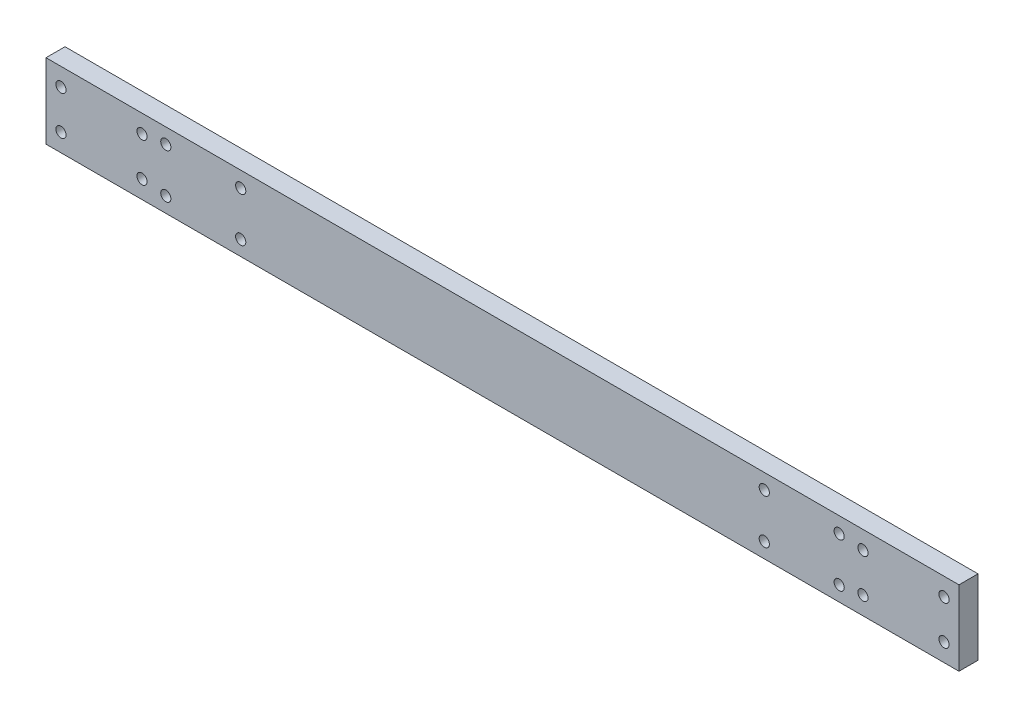
ISO-10303-21;
HEADER;
FILE_DESCRIPTION(('STEP AP214'),'2;1');
FILE_NAME('part.step','',(''),(''),'','','');
FILE_SCHEMA(('AUTOMOTIVE_DESIGN { 1 0 10303 214 1 1 1 1 }'));
ENDSEC;
DATA;
#1=APPLICATION_CONTEXT('core data for automotive mechanical design processes');
#2=APPLICATION_PROTOCOL_DEFINITION('international standard','automotive_design',2000,#1);
#3=PRODUCT_CONTEXT('',#1,'mechanical');
#4=PRODUCT('Part','Part','',(#3));
#5=PRODUCT_RELATED_PRODUCT_CATEGORY('part','',(#4));
#6=PRODUCT_DEFINITION_FORMATION('','',#4);
#7=PRODUCT_DEFINITION_CONTEXT('part definition',#1,'design');
#8=PRODUCT_DEFINITION('design','',#6,#7);
#9=PRODUCT_DEFINITION_SHAPE('','',#8);
#10=(LENGTH_UNIT() NAMED_UNIT(*) SI_UNIT(.MILLI.,.METRE.));
#11=(NAMED_UNIT(*) PLANE_ANGLE_UNIT() SI_UNIT($,.RADIAN.));
#12=(NAMED_UNIT(*) SI_UNIT($,.STERADIAN.) SOLID_ANGLE_UNIT());
#13=UNCERTAINTY_MEASURE_WITH_UNIT(LENGTH_MEASURE(1.E-05),#10,'distance_accuracy_value','');
#14=(GEOMETRIC_REPRESENTATION_CONTEXT(3) GLOBAL_UNCERTAINTY_ASSIGNED_CONTEXT((#13)) GLOBAL_UNIT_ASSIGNED_CONTEXT((#10,
#11,#12)) REPRESENTATION_CONTEXT('',''));
#15=CARTESIAN_POINT('',(0.,0.,0.));
#16=DIRECTION('',(0.,0.,1.));
#17=DIRECTION('',(1.,0.,0.));
#18=AXIS2_PLACEMENT_3D('',#15,#16,#17);
#19=CARTESIAN_POINT('',(264.023766162715,0.,6.35));
#20=DIRECTION('',(1.,0.,0.));
#21=DIRECTION('',(0.,0.,-1.));
#22=AXIS2_PLACEMENT_3D('',#19,#20,#21);
#23=PLANE('',#22);
#24=DIRECTION('',(0.,-1.,0.));
#25=VECTOR('',#24,1.);
#26=CARTESIAN_POINT('',(264.023766162715,0.,0.));
#27=LINE('',#26,#25);
#28=CARTESIAN_POINT('',(264.023766162715,235.923622409626,0.));
#29=VERTEX_POINT('',#28);
#30=CARTESIAN_POINT('',(264.023766162715,210.923622409626,0.));
#31=VERTEX_POINT('',#30);
#32=EDGE_CURVE('E103',#29,#31,#27,.T.);
#33=ORIENTED_EDGE('',*,*,#32,.F.);
#34=DIRECTION('',(0.,0.,-1.));
#35=VECTOR('',#34,1.);
#36=CARTESIAN_POINT('',(264.023766162715,235.923622409626,6.35));
#37=LINE('',#36,#35);
#38=CARTESIAN_POINT('',(264.023766162715,235.923622409626,6.35));
#39=VERTEX_POINT('',#38);
#40=EDGE_CURVE('E11',#39,#29,#37,.T.);
#41=ORIENTED_EDGE('',*,*,#40,.F.);
#42=DIRECTION('',(0.,-1.,0.));
#43=VECTOR('',#42,1.);
#44=CARTESIAN_POINT('',(264.023766162715,0.,6.35));
#45=LINE('',#44,#43);
#46=CARTESIAN_POINT('',(264.023766162715,210.923622409626,6.35));
#47=VERTEX_POINT('',#46);
#48=EDGE_CURVE('E96',#39,#47,#45,.T.);
#49=ORIENTED_EDGE('',*,*,#48,.T.);
#50=DIRECTION('',(0.,0.,-1.));
#51=VECTOR('',#50,1.);
#52=CARTESIAN_POINT('',(264.023766162715,210.923622409626,6.35));
#53=LINE('',#52,#51);
#54=EDGE_CURVE('E76',#47,#31,#53,.T.);
#55=ORIENTED_EDGE('',*,*,#54,.T.);
#56=EDGE_LOOP('',(#33,#41,#49,#55));
#57=FACE_BOUND('',#56,.T.);
#58=ADVANCED_FACE('F36',(#57),#23,.T.);
#59=CARTESIAN_POINT('',(0.,235.923622409626,6.35));
#60=DIRECTION('',(0.,1.,0.));
#61=DIRECTION('',(0.,0.,1.));
#62=AXIS2_PLACEMENT_3D('',#59,#60,#61);
#63=PLANE('',#62);
#64=DIRECTION('',(1.,0.,0.));
#65=VECTOR('',#64,1.);
#66=CARTESIAN_POINT('',(0.,235.923622409626,0.));
#67=LINE('',#66,#65);
#68=CARTESIAN_POINT('',(-40.7762338372855,235.923622409626,0.));
#69=VERTEX_POINT('',#68);
#70=EDGE_CURVE('E89',#69,#29,#67,.T.);
#71=ORIENTED_EDGE('',*,*,#70,.F.);
#72=DIRECTION('',(0.,0.,-1.));
#73=VECTOR('',#72,1.);
#74=CARTESIAN_POINT('',(-40.7762338372855,235.923622409626,6.35));
#75=LINE('',#74,#73);
#76=CARTESIAN_POINT('',(-40.7762338372855,235.923622409626,6.35));
#77=VERTEX_POINT('',#76);
#78=EDGE_CURVE('E45',#77,#69,#75,.T.);
#79=ORIENTED_EDGE('',*,*,#78,.F.);
#80=DIRECTION('',(1.,0.,0.));
#81=VECTOR('',#80,1.);
#82=CARTESIAN_POINT('',(0.,235.923622409626,6.35));
#83=LINE('',#82,#81);
#84=EDGE_CURVE('E87',#77,#39,#83,.T.);
#85=ORIENTED_EDGE('',*,*,#84,.T.);
#86=ORIENTED_EDGE('',*,*,#40,.T.);
#87=EDGE_LOOP('',(#71,#79,#85,#86));
#88=FACE_BOUND('',#87,.T.);
#89=ADVANCED_FACE('F85',(#88),#63,.T.);
#90=CARTESIAN_POINT('',(-40.7762338372855,0.,6.35));
#91=DIRECTION('',(1.,0.,0.));
#92=DIRECTION('',(0.,0.,-1.));
#93=AXIS2_PLACEMENT_3D('',#90,#91,#92);
#94=PLANE('',#93);
#95=DIRECTION('',(0.,-1.,0.));
#96=VECTOR('',#95,1.);
#97=CARTESIAN_POINT('',(-40.7762338372855,0.,0.));
#98=LINE('',#97,#96);
#99=CARTESIAN_POINT('',(-40.7762338372855,210.923622409626,0.));
#100=VERTEX_POINT('',#99);
#101=EDGE_CURVE('E69',#69,#100,#98,.T.);
#102=ORIENTED_EDGE('',*,*,#101,.T.);
#103=DIRECTION('',(0.,0.,-1.));
#104=VECTOR('',#103,1.);
#105=CARTESIAN_POINT('',(-40.7762338372855,210.923622409626,6.35));
#106=LINE('',#105,#104);
#107=CARTESIAN_POINT('',(-40.7762338372855,210.923622409626,6.35));
#108=VERTEX_POINT('',#107);
#109=EDGE_CURVE('E90',#108,#100,#106,.T.);
#110=ORIENTED_EDGE('',*,*,#109,.F.);
#111=DIRECTION('',(0.,-1.,0.));
#112=VECTOR('',#111,1.);
#113=CARTESIAN_POINT('',(-40.7762338372855,0.,6.35));
#114=LINE('',#113,#112);
#115=EDGE_CURVE('E92',#77,#108,#114,.T.);
#116=ORIENTED_EDGE('',*,*,#115,.F.);
#117=ORIENTED_EDGE('',*,*,#78,.T.);
#118=EDGE_LOOP('',(#102,#110,#116,#117));
#119=FACE_BOUND('',#118,.T.);
#120=ADVANCED_FACE('F93',(#119),#94,.F.);
#121=CARTESIAN_POINT('',(0.,210.923622409626,6.35));
#122=DIRECTION('',(0.,1.,0.));
#123=DIRECTION('',(0.,0.,1.));
#124=AXIS2_PLACEMENT_3D('',#121,#122,#123);
#125=PLANE('',#124);
#126=DIRECTION('',(1.,0.,0.));
#127=VECTOR('',#126,1.);
#128=CARTESIAN_POINT('',(0.,210.923622409626,0.));
#129=LINE('',#128,#127);
#130=EDGE_CURVE('E98',#100,#31,#129,.T.);
#131=ORIENTED_EDGE('',*,*,#130,.T.);
#132=ORIENTED_EDGE('',*,*,#54,.F.);
#133=DIRECTION('',(1.,0.,0.));
#134=VECTOR('',#133,1.);
#135=CARTESIAN_POINT('',(0.,210.923622409626,6.35));
#136=LINE('',#135,#134);
#137=EDGE_CURVE('E54',#108,#47,#136,.T.);
#138=ORIENTED_EDGE('',*,*,#137,.F.);
#139=ORIENTED_EDGE('',*,*,#109,.T.);
#140=EDGE_LOOP('',(#131,#132,#138,#139));
#141=FACE_BOUND('',#140,.T.);
#142=ADVANCED_FACE('F182',(#141),#125,.F.);
#143=CARTESIAN_POINT('',(0.,0.,6.35));
#144=DIRECTION('',(0.,0.,1.));
#145=DIRECTION('',(1.,0.,0.));
#146=AXIS2_PLACEMENT_3D('',#143,#144,#145);
#147=PLANE('',#146);
#148=CARTESIAN_POINT('',(-0.776233837280808,215.982232761852,6.35));
#149=DIRECTION('',(0.,0.,1.));
#150=DIRECTION('',(1.,0.,0.));
#151=AXIS2_PLACEMENT_3D('',#148,#149,#150);
#152=CIRCLE('',#151,1.7);
#153=CARTESIAN_POINT('',(0.923766162719196,215.982232761852,6.35));
#154=VERTEX_POINT('',#153);
#155=EDGE_CURVE('E296',#154,#154,#152,.T.);
#156=ORIENTED_EDGE('',*,*,#155,.F.);
#157=EDGE_LOOP('',(#156));
#158=FACE_BOUND('',#157,.T.);
#159=CARTESIAN_POINT('',(24.2237661627192,230.716645364441,6.35));
#160=DIRECTION('',(0.,0.,1.));
#161=DIRECTION('',(1.,0.,0.));
#162=AXIS2_PLACEMENT_3D('',#159,#160,#161);
#163=CIRCLE('',#162,1.7);
#164=CARTESIAN_POINT('',(25.9237661627192,230.716645364441,6.35));
#165=VERTEX_POINT('',#164);
#166=EDGE_CURVE('E289',#165,#165,#163,.T.);
#167=ORIENTED_EDGE('',*,*,#166,.F.);
#168=EDGE_LOOP('',(#167));
#169=FACE_BOUND('',#168,.T.);
#170=CARTESIAN_POINT('',(24.2237661627192,215.923622409625,6.35));
#171=DIRECTION('',(0.,0.,1.));
#172=DIRECTION('',(1.,0.,0.));
#173=AXIS2_PLACEMENT_3D('',#170,#171,#172);
#174=CIRCLE('',#173,1.7);
#175=CARTESIAN_POINT('',(25.9237661627192,215.923622409625,6.35));
#176=VERTEX_POINT('',#175);
#177=EDGE_CURVE('E285',#176,#176,#174,.T.);
#178=ORIENTED_EDGE('',*,*,#177,.F.);
#179=EDGE_LOOP('',(#178));
#180=FACE_BOUND('',#179,.T.);
#181=CARTESIAN_POINT('',(199.023766162719,215.98223276185,6.35));
#182=DIRECTION('',(0.,0.,1.));
#183=DIRECTION('',(1.,0.,0.));
#184=AXIS2_PLACEMENT_3D('',#181,#182,#183);
#185=CIRCLE('',#184,1.70000000000001);
#186=CARTESIAN_POINT('',(200.723766162719,215.98223276185,6.35));
#187=VERTEX_POINT('',#186);
#188=EDGE_CURVE('E275',#187,#187,#185,.T.);
#189=ORIENTED_EDGE('',*,*,#188,.F.);
#190=EDGE_LOOP('',(#189));
#191=FACE_BOUND('',#190,.T.);
#192=CARTESIAN_POINT('',(-35.7762338372859,216.923622409625,6.35));
#193=DIRECTION('',(0.,0.,1.));
#194=DIRECTION('',(1.,0.,0.));
#195=AXIS2_PLACEMENT_3D('',#192,#193,#194);
#196=CIRCLE('',#195,1.69999999999998);
#197=CARTESIAN_POINT('',(-34.0762338372859,216.923622409625,6.35));
#198=VERTEX_POINT('',#197);
#199=EDGE_CURVE('E305',#198,#198,#196,.T.);
#200=ORIENTED_EDGE('',*,*,#199,.F.);
#201=EDGE_LOOP('',(#200));
#202=FACE_BOUND('',#201,.T.);
#203=CARTESIAN_POINT('',(-8.72623383728555,229.923622409625,6.35));
#204=DIRECTION('',(0.,0.,1.));
#205=DIRECTION('',(1.,0.,0.));
#206=AXIS2_PLACEMENT_3D('',#203,#204,#205);
#207=CIRCLE('',#206,1.69999999999998);
#208=CARTESIAN_POINT('',(-7.02623383728556,229.923622409625,6.35));
#209=VERTEX_POINT('',#208);
#210=EDGE_CURVE('E302',#209,#209,#207,.T.);
#211=ORIENTED_EDGE('',*,*,#210,.F.);
#212=EDGE_LOOP('',(#211));
#213=FACE_BOUND('',#212,.T.);
#214=CARTESIAN_POINT('',(-8.72623383728555,216.923622409625,6.35));
#215=DIRECTION('',(0.,0.,1.));
#216=DIRECTION('',(1.,0.,0.));
#217=AXIS2_PLACEMENT_3D('',#214,#215,#216);
#218=CIRCLE('',#217,1.69999999999998);
#219=CARTESIAN_POINT('',(-7.02623383728556,216.923622409625,6.35));
#220=VERTEX_POINT('',#219);
#221=EDGE_CURVE('E222',#220,#220,#218,.T.);
#222=ORIENTED_EDGE('',*,*,#221,.F.);
#223=EDGE_LOOP('',(#222));
#224=FACE_BOUND('',#223,.T.);
#225=CARTESIAN_POINT('',(-0.776233837280815,230.865006717261,6.35));
#226=DIRECTION('',(0.,0.,1.));
#227=DIRECTION('',(1.,0.,0.));
#228=AXIS2_PLACEMENT_3D('',#225,#226,#227);
#229=CIRCLE('',#228,1.7);
#230=CARTESIAN_POINT('',(0.923766162719189,230.865006717261,6.35));
#231=VERTEX_POINT('',#230);
#232=EDGE_CURVE('E298',#231,#231,#229,.T.);
#233=ORIENTED_EDGE('',*,*,#232,.F.);
#234=EDGE_LOOP('',(#233));
#235=FACE_BOUND('',#234,.T.);
#236=CARTESIAN_POINT('',(259.023766162715,229.923622409626,6.35));
#237=DIRECTION('',(0.,0.,1.));
#238=DIRECTION('',(1.,0.,0.));
#239=AXIS2_PLACEMENT_3D('',#236,#237,#238);
#240=CIRCLE('',#239,1.69999999999996);
#241=CARTESIAN_POINT('',(260.723766162715,229.923622409626,6.35));
#242=VERTEX_POINT('',#241);
#243=EDGE_CURVE('E321',#242,#242,#240,.T.);
#244=ORIENTED_EDGE('',*,*,#243,.F.);
#245=EDGE_LOOP('',(#244));
#246=FACE_BOUND('',#245,.T.);
#247=CARTESIAN_POINT('',(259.023766162715,216.923622409626,6.35));
#248=DIRECTION('',(0.,0.,1.));
#249=DIRECTION('',(1.,0.,0.));
#250=AXIS2_PLACEMENT_3D('',#247,#248,#249);
#251=CIRCLE('',#250,1.69999999999996);
#252=CARTESIAN_POINT('',(260.723766162715,216.923622409626,6.35));
#253=VERTEX_POINT('',#252);
#254=EDGE_CURVE('E325',#253,#253,#251,.T.);
#255=ORIENTED_EDGE('',*,*,#254,.F.);
#256=EDGE_LOOP('',(#255));
#257=FACE_BOUND('',#256,.T.);
#258=CARTESIAN_POINT('',(231.973766162719,216.923622409623,6.35));
#259=DIRECTION('',(0.,0.,1.));
#260=DIRECTION('',(1.,0.,0.));
#261=AXIS2_PLACEMENT_3D('',#258,#259,#260);
#262=CIRCLE('',#261,1.69999999999999);
#263=CARTESIAN_POINT('',(233.673766162719,216.923622409623,6.35));
#264=VERTEX_POINT('',#263);
#265=EDGE_CURVE('E329',#264,#264,#262,.T.);
#266=ORIENTED_EDGE('',*,*,#265,.F.);
#267=EDGE_LOOP('',(#266));
#268=FACE_BOUND('',#267,.T.);
#269=CARTESIAN_POINT('',(199.023766162719,230.865006717259,6.35));
#270=DIRECTION('',(0.,0.,1.));
#271=DIRECTION('',(1.,0.,0.));
#272=AXIS2_PLACEMENT_3D('',#269,#270,#271);
#273=CIRCLE('',#272,1.70000000000001);
#274=CARTESIAN_POINT('',(200.723766162719,230.865006717259,6.35));
#275=VERTEX_POINT('',#274);
#276=EDGE_CURVE('E286',#275,#275,#273,.T.);
#277=ORIENTED_EDGE('',*,*,#276,.F.);
#278=EDGE_LOOP('',(#277));
#279=FACE_BOUND('',#278,.T.);
#280=CARTESIAN_POINT('',(224.023766162719,230.716645364439,6.35));
#281=DIRECTION('',(0.,0.,1.));
#282=DIRECTION('',(1.,0.,0.));
#283=AXIS2_PLACEMENT_3D('',#280,#281,#282);
#284=CIRCLE('',#283,1.70000000000001);
#285=CARTESIAN_POINT('',(225.723766162719,230.716645364439,6.35));
#286=VERTEX_POINT('',#285);
#287=EDGE_CURVE('E292',#286,#286,#284,.T.);
#288=ORIENTED_EDGE('',*,*,#287,.F.);
#289=EDGE_LOOP('',(#288));
#290=FACE_BOUND('',#289,.T.);
#291=CARTESIAN_POINT('',(224.023766162719,215.923622409624,6.35));
#292=DIRECTION('',(0.,0.,1.));
#293=DIRECTION('',(1.,0.,0.));
#294=AXIS2_PLACEMENT_3D('',#291,#292,#293);
#295=CIRCLE('',#294,1.70000000000001);
#296=CARTESIAN_POINT('',(225.723766162719,215.923622409624,6.35));
#297=VERTEX_POINT('',#296);
#298=EDGE_CURVE('E338',#297,#297,#295,.T.);
#299=ORIENTED_EDGE('',*,*,#298,.F.);
#300=EDGE_LOOP('',(#299));
#301=FACE_BOUND('',#300,.T.);
#302=CARTESIAN_POINT('',(231.973766162719,229.923622409623,6.35));
#303=DIRECTION('',(0.,0.,1.));
#304=DIRECTION('',(1.,0.,0.));
#305=AXIS2_PLACEMENT_3D('',#302,#303,#304);
#306=CIRCLE('',#305,1.69999999999999);
#307=CARTESIAN_POINT('',(233.673766162719,229.923622409623,6.35));
#308=VERTEX_POINT('',#307);
#309=EDGE_CURVE('E340',#308,#308,#306,.T.);
#310=ORIENTED_EDGE('',*,*,#309,.F.);
#311=EDGE_LOOP('',(#310));
#312=FACE_BOUND('',#311,.T.);
#313=CARTESIAN_POINT('',(-35.7762338372862,229.923622409625,6.35));
#314=DIRECTION('',(0.,0.,1.));
#315=DIRECTION('',(1.,0.,0.));
#316=AXIS2_PLACEMENT_3D('',#313,#314,#315);
#317=CIRCLE('',#316,1.69999999999998);
#318=CARTESIAN_POINT('',(-34.0762338372862,229.923622409625,6.35));
#319=VERTEX_POINT('',#318);
#320=EDGE_CURVE('E115',#319,#319,#317,.T.);
#321=ORIENTED_EDGE('',*,*,#320,.F.);
#322=EDGE_LOOP('',(#321));
#323=FACE_BOUND('',#322,.T.);
#324=ORIENTED_EDGE('',*,*,#48,.F.);
#325=ORIENTED_EDGE('',*,*,#84,.F.);
#326=ORIENTED_EDGE('',*,*,#115,.T.);
#327=ORIENTED_EDGE('',*,*,#137,.T.);
#328=EDGE_LOOP('',(#324,#325,#326,#327));
#329=FACE_BOUND('',#328,.T.);
#330=ADVANCED_FACE('F95',(#158,#169,#180,#191,#202,#213,#224,#235,#246,#257,#268,#279,#290,#301,
#312,#323,#329),#147,.T.);
#331=CARTESIAN_POINT('',(0.,0.,0.));
#332=DIRECTION('',(0.,0.,1.));
#333=DIRECTION('',(1.,0.,0.));
#334=AXIS2_PLACEMENT_3D('',#331,#332,#333);
#335=PLANE('',#334);
#336=CARTESIAN_POINT('',(-0.776233837280808,215.982232761852,0.));
#337=DIRECTION('',(0.,0.,1.));
#338=DIRECTION('',(1.,0.,0.));
#339=AXIS2_PLACEMENT_3D('',#336,#337,#338);
#340=CIRCLE('',#339,1.7);
#341=CARTESIAN_POINT('',(0.923766162719196,215.982232761852,0.));
#342=VERTEX_POINT('',#341);
#343=EDGE_CURVE('E39',#342,#342,#340,.T.);
#344=ORIENTED_EDGE('',*,*,#343,.T.);
#345=EDGE_LOOP('',(#344));
#346=FACE_BOUND('',#345,.T.);
#347=CARTESIAN_POINT('',(24.2237661627192,230.716645364441,0.));
#348=DIRECTION('',(0.,0.,1.));
#349=DIRECTION('',(1.,0.,0.));
#350=AXIS2_PLACEMENT_3D('',#347,#348,#349);
#351=CIRCLE('',#350,1.7);
#352=CARTESIAN_POINT('',(25.9237661627192,230.716645364441,0.));
#353=VERTEX_POINT('',#352);
#354=EDGE_CURVE('E153',#353,#353,#351,.T.);
#355=ORIENTED_EDGE('',*,*,#354,.T.);
#356=EDGE_LOOP('',(#355));
#357=FACE_BOUND('',#356,.T.);
#358=CARTESIAN_POINT('',(24.2237661627192,215.923622409625,0.));
#359=DIRECTION('',(0.,0.,1.));
#360=DIRECTION('',(1.,0.,0.));
#361=AXIS2_PLACEMENT_3D('',#358,#359,#360);
#362=CIRCLE('',#361,1.7);
#363=CARTESIAN_POINT('',(25.9237661627192,215.923622409625,0.));
#364=VERTEX_POINT('',#363);
#365=EDGE_CURVE('E151',#364,#364,#362,.T.);
#366=ORIENTED_EDGE('',*,*,#365,.T.);
#367=EDGE_LOOP('',(#366));
#368=FACE_BOUND('',#367,.T.);
#369=CARTESIAN_POINT('',(199.023766162719,215.98223276185,0.));
#370=DIRECTION('',(0.,0.,1.));
#371=DIRECTION('',(1.,0.,0.));
#372=AXIS2_PLACEMENT_3D('',#369,#370,#371);
#373=CIRCLE('',#372,1.70000000000001);
#374=CARTESIAN_POINT('',(200.723766162719,215.98223276185,0.));
#375=VERTEX_POINT('',#374);
#376=EDGE_CURVE('E148',#375,#375,#373,.T.);
#377=ORIENTED_EDGE('',*,*,#376,.T.);
#378=EDGE_LOOP('',(#377));
#379=FACE_BOUND('',#378,.T.);
#380=CARTESIAN_POINT('',(-35.7762338372859,216.923622409625,0.));
#381=DIRECTION('',(0.,0.,1.));
#382=DIRECTION('',(1.,0.,0.));
#383=AXIS2_PLACEMENT_3D('',#380,#381,#382);
#384=CIRCLE('',#383,1.69999999999998);
#385=CARTESIAN_POINT('',(-34.0762338372859,216.923622409625,0.));
#386=VERTEX_POINT('',#385);
#387=EDGE_CURVE('E145',#386,#386,#384,.T.);
#388=ORIENTED_EDGE('',*,*,#387,.T.);
#389=EDGE_LOOP('',(#388));
#390=FACE_BOUND('',#389,.T.);
#391=CARTESIAN_POINT('',(-8.72623383728555,229.923622409625,0.));
#392=DIRECTION('',(0.,0.,1.));
#393=DIRECTION('',(1.,0.,0.));
#394=AXIS2_PLACEMENT_3D('',#391,#392,#393);
#395=CIRCLE('',#394,1.69999999999998);
#396=CARTESIAN_POINT('',(-7.02623383728556,229.923622409625,0.));
#397=VERTEX_POINT('',#396);
#398=EDGE_CURVE('E142',#397,#397,#395,.T.);
#399=ORIENTED_EDGE('',*,*,#398,.T.);
#400=EDGE_LOOP('',(#399));
#401=FACE_BOUND('',#400,.T.);
#402=CARTESIAN_POINT('',(-8.72623383728555,216.923622409625,0.));
#403=DIRECTION('',(0.,0.,1.));
#404=DIRECTION('',(1.,0.,0.));
#405=AXIS2_PLACEMENT_3D('',#402,#403,#404);
#406=CIRCLE('',#405,1.69999999999998);
#407=CARTESIAN_POINT('',(-7.02623383728556,216.923622409625,0.));
#408=VERTEX_POINT('',#407);
#409=EDGE_CURVE('E139',#408,#408,#406,.T.);
#410=ORIENTED_EDGE('',*,*,#409,.T.);
#411=EDGE_LOOP('',(#410));
#412=FACE_BOUND('',#411,.T.);
#413=CARTESIAN_POINT('',(-0.776233837280815,230.865006717261,0.));
#414=DIRECTION('',(0.,0.,1.));
#415=DIRECTION('',(1.,0.,0.));
#416=AXIS2_PLACEMENT_3D('',#413,#414,#415);
#417=CIRCLE('',#416,1.7);
#418=CARTESIAN_POINT('',(0.923766162719189,230.865006717261,0.));
#419=VERTEX_POINT('',#418);
#420=EDGE_CURVE('E136',#419,#419,#417,.T.);
#421=ORIENTED_EDGE('',*,*,#420,.T.);
#422=EDGE_LOOP('',(#421));
#423=FACE_BOUND('',#422,.T.);
#424=CARTESIAN_POINT('',(259.023766162715,229.923622409626,0.));
#425=DIRECTION('',(0.,0.,1.));
#426=DIRECTION('',(1.,0.,0.));
#427=AXIS2_PLACEMENT_3D('',#424,#425,#426);
#428=CIRCLE('',#427,1.69999999999996);
#429=CARTESIAN_POINT('',(260.723766162715,229.923622409626,0.));
#430=VERTEX_POINT('',#429);
#431=EDGE_CURVE('E133',#430,#430,#428,.T.);
#432=ORIENTED_EDGE('',*,*,#431,.T.);
#433=EDGE_LOOP('',(#432));
#434=FACE_BOUND('',#433,.T.);
#435=CARTESIAN_POINT('',(259.023766162715,216.923622409626,0.));
#436=DIRECTION('',(0.,0.,1.));
#437=DIRECTION('',(1.,0.,0.));
#438=AXIS2_PLACEMENT_3D('',#435,#436,#437);
#439=CIRCLE('',#438,1.69999999999996);
#440=CARTESIAN_POINT('',(260.723766162715,216.923622409626,0.));
#441=VERTEX_POINT('',#440);
#442=EDGE_CURVE('E130',#441,#441,#439,.T.);
#443=ORIENTED_EDGE('',*,*,#442,.T.);
#444=EDGE_LOOP('',(#443));
#445=FACE_BOUND('',#444,.T.);
#446=CARTESIAN_POINT('',(231.973766162719,216.923622409623,0.));
#447=DIRECTION('',(0.,0.,1.));
#448=DIRECTION('',(1.,0.,0.));
#449=AXIS2_PLACEMENT_3D('',#446,#447,#448);
#450=CIRCLE('',#449,1.69999999999999);
#451=CARTESIAN_POINT('',(233.673766162719,216.923622409623,0.));
#452=VERTEX_POINT('',#451);
#453=EDGE_CURVE('E127',#452,#452,#450,.T.);
#454=ORIENTED_EDGE('',*,*,#453,.T.);
#455=EDGE_LOOP('',(#454));
#456=FACE_BOUND('',#455,.T.);
#457=CARTESIAN_POINT('',(199.023766162719,230.865006717259,0.));
#458=DIRECTION('',(0.,0.,1.));
#459=DIRECTION('',(1.,0.,0.));
#460=AXIS2_PLACEMENT_3D('',#457,#458,#459);
#461=CIRCLE('',#460,1.70000000000001);
#462=CARTESIAN_POINT('',(200.723766162719,230.865006717259,0.));
#463=VERTEX_POINT('',#462);
#464=EDGE_CURVE('E124',#463,#463,#461,.T.);
#465=ORIENTED_EDGE('',*,*,#464,.T.);
#466=EDGE_LOOP('',(#465));
#467=FACE_BOUND('',#466,.T.);
#468=CARTESIAN_POINT('',(224.023766162719,230.716645364439,0.));
#469=DIRECTION('',(0.,0.,1.));
#470=DIRECTION('',(1.,0.,0.));
#471=AXIS2_PLACEMENT_3D('',#468,#469,#470);
#472=CIRCLE('',#471,1.70000000000001);
#473=CARTESIAN_POINT('',(225.723766162719,230.716645364439,0.));
#474=VERTEX_POINT('',#473);
#475=EDGE_CURVE('E121',#474,#474,#472,.T.);
#476=ORIENTED_EDGE('',*,*,#475,.T.);
#477=EDGE_LOOP('',(#476));
#478=FACE_BOUND('',#477,.T.);
#479=CARTESIAN_POINT('',(224.023766162719,215.923622409624,0.));
#480=DIRECTION('',(0.,0.,1.));
#481=DIRECTION('',(1.,0.,0.));
#482=AXIS2_PLACEMENT_3D('',#479,#480,#481);
#483=CIRCLE('',#482,1.70000000000001);
#484=CARTESIAN_POINT('',(225.723766162719,215.923622409624,0.));
#485=VERTEX_POINT('',#484);
#486=EDGE_CURVE('E118',#485,#485,#483,.T.);
#487=ORIENTED_EDGE('',*,*,#486,.T.);
#488=EDGE_LOOP('',(#487));
#489=FACE_BOUND('',#488,.T.);
#490=CARTESIAN_POINT('',(231.973766162719,229.923622409623,0.));
#491=DIRECTION('',(0.,0.,1.));
#492=DIRECTION('',(1.,0.,0.));
#493=AXIS2_PLACEMENT_3D('',#490,#491,#492);
#494=CIRCLE('',#493,1.69999999999999);
#495=CARTESIAN_POINT('',(233.673766162719,229.923622409623,0.));
#496=VERTEX_POINT('',#495);
#497=EDGE_CURVE('E114',#496,#496,#494,.T.);
#498=ORIENTED_EDGE('',*,*,#497,.T.);
#499=EDGE_LOOP('',(#498));
#500=FACE_BOUND('',#499,.T.);
#501=CARTESIAN_POINT('',(-35.7762338372862,229.923622409625,0.));
#502=DIRECTION('',(0.,0.,1.));
#503=DIRECTION('',(1.,0.,0.));
#504=AXIS2_PLACEMENT_3D('',#501,#502,#503);
#505=CIRCLE('',#504,1.69999999999998);
#506=CARTESIAN_POINT('',(-34.0762338372862,229.923622409625,0.));
#507=VERTEX_POINT('',#506);
#508=EDGE_CURVE('E111',#507,#507,#505,.T.);
#509=ORIENTED_EDGE('',*,*,#508,.T.);
#510=EDGE_LOOP('',(#509));
#511=FACE_BOUND('',#510,.T.);
#512=ORIENTED_EDGE('',*,*,#32,.T.);
#513=ORIENTED_EDGE('',*,*,#130,.F.);
#514=ORIENTED_EDGE('',*,*,#101,.F.);
#515=ORIENTED_EDGE('',*,*,#70,.T.);
#516=EDGE_LOOP('',(#512,#513,#514,#515));
#517=FACE_BOUND('',#516,.T.);
#518=ADVANCED_FACE('F160',(#346,#357,#368,#379,#390,#401,#412,#423,#434,#445,#456,#467,#478,
#489,#500,#511,#517),#335,.F.);
#519=CARTESIAN_POINT('',(-35.7762338372862,229.923622409625,-15.65));
#520=DIRECTION('',(0.,0.,1.));
#521=DIRECTION('',(1.,0.,0.));
#522=AXIS2_PLACEMENT_3D('',#519,#520,#521);
#523=CYLINDRICAL_SURFACE('',#522,1.69999999999998);
#524=ORIENTED_EDGE('',*,*,#320,.T.);
#525=EDGE_LOOP('',(#524));
#526=FACE_BOUND('',#525,.T.);
#527=ORIENTED_EDGE('',*,*,#508,.F.);
#528=EDGE_LOOP('',(#527));
#529=FACE_BOUND('',#528,.T.);
#530=ADVANCED_FACE('F194',(#526,#529),#523,.F.);
#531=CARTESIAN_POINT('',(231.973766162719,229.923622409623,-15.65));
#532=DIRECTION('',(0.,0.,1.));
#533=DIRECTION('',(1.,0.,0.));
#534=AXIS2_PLACEMENT_3D('',#531,#532,#533);
#535=CYLINDRICAL_SURFACE('',#534,1.69999999999999);
#536=ORIENTED_EDGE('',*,*,#309,.T.);
#537=EDGE_LOOP('',(#536));
#538=FACE_BOUND('',#537,.T.);
#539=ORIENTED_EDGE('',*,*,#497,.F.);
#540=EDGE_LOOP('',(#539));
#541=FACE_BOUND('',#540,.T.);
#542=ADVANCED_FACE('F198',(#538,#541),#535,.F.);
#543=CARTESIAN_POINT('',(224.023766162719,215.923622409624,-15.65));
#544=DIRECTION('',(0.,0.,1.));
#545=DIRECTION('',(1.,0.,0.));
#546=AXIS2_PLACEMENT_3D('',#543,#544,#545);
#547=CYLINDRICAL_SURFACE('',#546,1.70000000000001);
#548=ORIENTED_EDGE('',*,*,#298,.T.);
#549=EDGE_LOOP('',(#548));
#550=FACE_BOUND('',#549,.T.);
#551=ORIENTED_EDGE('',*,*,#486,.F.);
#552=EDGE_LOOP('',(#551));
#553=FACE_BOUND('',#552,.T.);
#554=ADVANCED_FACE('F246',(#550,#553),#547,.F.);
#555=CARTESIAN_POINT('',(224.023766162719,230.716645364439,-15.65));
#556=DIRECTION('',(0.,0.,1.));
#557=DIRECTION('',(1.,0.,0.));
#558=AXIS2_PLACEMENT_3D('',#555,#556,#557);
#559=CYLINDRICAL_SURFACE('',#558,1.70000000000001);
#560=ORIENTED_EDGE('',*,*,#287,.T.);
#561=EDGE_LOOP('',(#560));
#562=FACE_BOUND('',#561,.T.);
#563=ORIENTED_EDGE('',*,*,#475,.F.);
#564=EDGE_LOOP('',(#563));
#565=FACE_BOUND('',#564,.T.);
#566=ADVANCED_FACE('F252',(#562,#565),#559,.F.);
#567=CARTESIAN_POINT('',(199.023766162719,230.865006717259,-15.65));
#568=DIRECTION('',(0.,0.,1.));
#569=DIRECTION('',(1.,0.,0.));
#570=AXIS2_PLACEMENT_3D('',#567,#568,#569);
#571=CYLINDRICAL_SURFACE('',#570,1.70000000000001);
#572=ORIENTED_EDGE('',*,*,#276,.T.);
#573=EDGE_LOOP('',(#572));
#574=FACE_BOUND('',#573,.T.);
#575=ORIENTED_EDGE('',*,*,#464,.F.);
#576=EDGE_LOOP('',(#575));
#577=FACE_BOUND('',#576,.T.);
#578=ADVANCED_FACE('F258',(#574,#577),#571,.F.);
#579=CARTESIAN_POINT('',(231.973766162719,216.923622409623,-15.65));
#580=DIRECTION('',(0.,0.,1.));
#581=DIRECTION('',(1.,0.,0.));
#582=AXIS2_PLACEMENT_3D('',#579,#580,#581);
#583=CYLINDRICAL_SURFACE('',#582,1.69999999999999);
#584=ORIENTED_EDGE('',*,*,#265,.T.);
#585=EDGE_LOOP('',(#584));
#586=FACE_BOUND('',#585,.T.);
#587=ORIENTED_EDGE('',*,*,#453,.F.);
#588=EDGE_LOOP('',(#587));
#589=FACE_BOUND('',#588,.T.);
#590=ADVANCED_FACE('F261',(#586,#589),#583,.F.);
#591=CARTESIAN_POINT('',(259.023766162715,216.923622409626,-15.65));
#592=DIRECTION('',(0.,0.,1.));
#593=DIRECTION('',(1.,0.,0.));
#594=AXIS2_PLACEMENT_3D('',#591,#592,#593);
#595=CYLINDRICAL_SURFACE('',#594,1.69999999999996);
#596=ORIENTED_EDGE('',*,*,#254,.T.);
#597=EDGE_LOOP('',(#596));
#598=FACE_BOUND('',#597,.T.);
#599=ORIENTED_EDGE('',*,*,#442,.F.);
#600=EDGE_LOOP('',(#599));
#601=FACE_BOUND('',#600,.T.);
#602=ADVANCED_FACE('F348',(#598,#601),#595,.F.);
#603=CARTESIAN_POINT('',(259.023766162715,229.923622409626,-15.65));
#604=DIRECTION('',(0.,0.,1.));
#605=DIRECTION('',(1.,0.,0.));
#606=AXIS2_PLACEMENT_3D('',#603,#604,#605);
#607=CYLINDRICAL_SURFACE('',#606,1.69999999999996);
#608=ORIENTED_EDGE('',*,*,#243,.T.);
#609=EDGE_LOOP('',(#608));
#610=FACE_BOUND('',#609,.T.);
#611=ORIENTED_EDGE('',*,*,#431,.F.);
#612=EDGE_LOOP('',(#611));
#613=FACE_BOUND('',#612,.T.);
#614=ADVANCED_FACE('F213',(#610,#613),#607,.F.);
#615=CARTESIAN_POINT('',(-0.776233837280815,230.865006717261,-15.65));
#616=DIRECTION('',(0.,0.,1.));
#617=DIRECTION('',(1.,0.,0.));
#618=AXIS2_PLACEMENT_3D('',#615,#616,#617);
#619=CYLINDRICAL_SURFACE('',#618,1.7);
#620=ORIENTED_EDGE('',*,*,#232,.T.);
#621=EDGE_LOOP('',(#620));
#622=FACE_BOUND('',#621,.T.);
#623=ORIENTED_EDGE('',*,*,#420,.F.);
#624=EDGE_LOOP('',(#623));
#625=FACE_BOUND('',#624,.T.);
#626=ADVANCED_FACE('F210',(#622,#625),#619,.F.);
#627=CARTESIAN_POINT('',(-8.72623383728555,216.923622409625,-15.65));
#628=DIRECTION('',(0.,0.,1.));
#629=DIRECTION('',(1.,0.,0.));
#630=AXIS2_PLACEMENT_3D('',#627,#628,#629);
#631=CYLINDRICAL_SURFACE('',#630,1.69999999999998);
#632=ORIENTED_EDGE('',*,*,#221,.T.);
#633=EDGE_LOOP('',(#632));
#634=FACE_BOUND('',#633,.T.);
#635=ORIENTED_EDGE('',*,*,#409,.F.);
#636=EDGE_LOOP('',(#635));
#637=FACE_BOUND('',#636,.T.);
#638=ADVANCED_FACE('F204',(#634,#637),#631,.F.);
#639=CARTESIAN_POINT('',(-8.72623383728555,229.923622409625,-15.65));
#640=DIRECTION('',(0.,0.,1.));
#641=DIRECTION('',(1.,0.,0.));
#642=AXIS2_PLACEMENT_3D('',#639,#640,#641);
#643=CYLINDRICAL_SURFACE('',#642,1.69999999999998);
#644=ORIENTED_EDGE('',*,*,#210,.T.);
#645=EDGE_LOOP('',(#644));
#646=FACE_BOUND('',#645,.T.);
#647=ORIENTED_EDGE('',*,*,#398,.F.);
#648=EDGE_LOOP('',(#647));
#649=FACE_BOUND('',#648,.T.);
#650=ADVANCED_FACE('F200',(#646,#649),#643,.F.);
#651=CARTESIAN_POINT('',(-35.7762338372859,216.923622409625,-15.65));
#652=DIRECTION('',(0.,0.,1.));
#653=DIRECTION('',(1.,0.,0.));
#654=AXIS2_PLACEMENT_3D('',#651,#652,#653);
#655=CYLINDRICAL_SURFACE('',#654,1.69999999999998);
#656=ORIENTED_EDGE('',*,*,#199,.T.);
#657=EDGE_LOOP('',(#656));
#658=FACE_BOUND('',#657,.T.);
#659=ORIENTED_EDGE('',*,*,#387,.F.);
#660=EDGE_LOOP('',(#659));
#661=FACE_BOUND('',#660,.T.);
#662=ADVANCED_FACE('F203',(#658,#661),#655,.F.);
#663=CARTESIAN_POINT('',(199.023766162719,215.98223276185,-15.65));
#664=DIRECTION('',(0.,0.,1.));
#665=DIRECTION('',(1.,0.,0.));
#666=AXIS2_PLACEMENT_3D('',#663,#664,#665);
#667=CYLINDRICAL_SURFACE('',#666,1.70000000000001);
#668=ORIENTED_EDGE('',*,*,#188,.T.);
#669=EDGE_LOOP('',(#668));
#670=FACE_BOUND('',#669,.T.);
#671=ORIENTED_EDGE('',*,*,#376,.F.);
#672=EDGE_LOOP('',(#671));
#673=FACE_BOUND('',#672,.T.);
#674=ADVANCED_FACE('F208',(#670,#673),#667,.F.);
#675=CARTESIAN_POINT('',(24.2237661627192,215.923622409625,-15.65));
#676=DIRECTION('',(0.,0.,1.));
#677=DIRECTION('',(1.,0.,0.));
#678=AXIS2_PLACEMENT_3D('',#675,#676,#677);
#679=CYLINDRICAL_SURFACE('',#678,1.7);
#680=ORIENTED_EDGE('',*,*,#177,.T.);
#681=EDGE_LOOP('',(#680));
#682=FACE_BOUND('',#681,.T.);
#683=ORIENTED_EDGE('',*,*,#365,.F.);
#684=EDGE_LOOP('',(#683));
#685=FACE_BOUND('',#684,.T.);
#686=ADVANCED_FACE('F170',(#682,#685),#679,.F.);
#687=CARTESIAN_POINT('',(24.2237661627192,230.716645364441,-15.65));
#688=DIRECTION('',(0.,0.,1.));
#689=DIRECTION('',(1.,0.,0.));
#690=AXIS2_PLACEMENT_3D('',#687,#688,#689);
#691=CYLINDRICAL_SURFACE('',#690,1.7);
#692=ORIENTED_EDGE('',*,*,#166,.T.);
#693=EDGE_LOOP('',(#692));
#694=FACE_BOUND('',#693,.T.);
#695=ORIENTED_EDGE('',*,*,#354,.F.);
#696=EDGE_LOOP('',(#695));
#697=FACE_BOUND('',#696,.T.);
#698=ADVANCED_FACE('F164',(#694,#697),#691,.F.);
#699=CARTESIAN_POINT('',(-0.776233837280808,215.982232761852,-15.65));
#700=DIRECTION('',(0.,0.,1.));
#701=DIRECTION('',(1.,0.,0.));
#702=AXIS2_PLACEMENT_3D('',#699,#700,#701);
#703=CYLINDRICAL_SURFACE('',#702,1.7);
#704=ORIENTED_EDGE('',*,*,#155,.T.);
#705=EDGE_LOOP('',(#704));
#706=FACE_BOUND('',#705,.T.);
#707=ORIENTED_EDGE('',*,*,#343,.F.);
#708=EDGE_LOOP('',(#707));
#709=FACE_BOUND('',#708,.T.);
#710=ADVANCED_FACE('F162',(#706,#709),#703,.F.);
#711=CLOSED_SHELL('',(#58,#89,#120,#142,#330,#518,#530,#542,#554,#566,#578,#590,#602,#614,#626,
#638,#650,#662,#674,#686,#698,#710));
#712=MANIFOLD_SOLID_BREP('B2',#711);
#713=ADVANCED_BREP_SHAPE_REPRESENTATION('',(#18,#712),#14);
#714=SHAPE_DEFINITION_REPRESENTATION(#9,#713);
ENDSEC;
END-ISO-10303-21;
